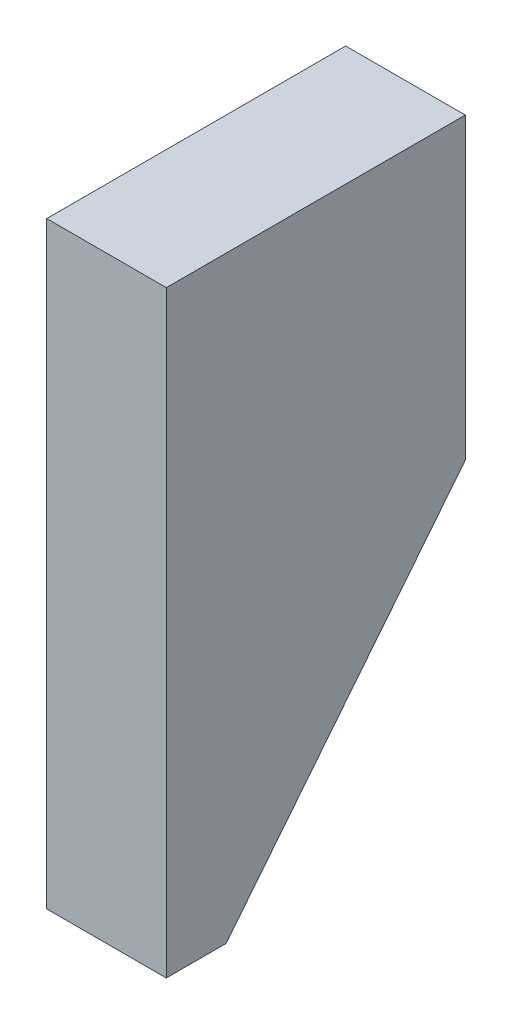
ISO-10303-21;
HEADER;
FILE_DESCRIPTION(('STEP AP214'),'2;1');
FILE_NAME('part.step','',(''),(''),'','','');
FILE_SCHEMA(('AUTOMOTIVE_DESIGN { 1 0 10303 214 1 1 1 1 }'));
ENDSEC;
DATA;
#1=APPLICATION_CONTEXT('core data for automotive mechanical design processes');
#2=APPLICATION_PROTOCOL_DEFINITION('international standard','automotive_design',2000,#1);
#3=PRODUCT_CONTEXT('',#1,'mechanical');
#4=PRODUCT('Part','Part','',(#3));
#5=PRODUCT_RELATED_PRODUCT_CATEGORY('part','',(#4));
#6=PRODUCT_DEFINITION_FORMATION('','',#4);
#7=PRODUCT_DEFINITION_CONTEXT('part definition',#1,'design');
#8=PRODUCT_DEFINITION('design','',#6,#7);
#9=PRODUCT_DEFINITION_SHAPE('','',#8);
#10=(LENGTH_UNIT() NAMED_UNIT(*) SI_UNIT(.MILLI.,.METRE.));
#11=(NAMED_UNIT(*) PLANE_ANGLE_UNIT() SI_UNIT($,.RADIAN.));
#12=(NAMED_UNIT(*) SI_UNIT($,.STERADIAN.) SOLID_ANGLE_UNIT());
#13=UNCERTAINTY_MEASURE_WITH_UNIT(LENGTH_MEASURE(1.E-05),#10,'distance_accuracy_value','');
#14=(GEOMETRIC_REPRESENTATION_CONTEXT(3) GLOBAL_UNCERTAINTY_ASSIGNED_CONTEXT((#13)) GLOBAL_UNIT_ASSIGNED_CONTEXT((#10,
#11,#12)) REPRESENTATION_CONTEXT('',''));
#15=CARTESIAN_POINT('',(0.,0.,0.));
#16=DIRECTION('',(0.,0.,1.));
#17=DIRECTION('',(1.,0.,0.));
#18=AXIS2_PLACEMENT_3D('',#15,#16,#17);
#19=CARTESIAN_POINT('',(0.,0.,0.));
#20=DIRECTION('',(-1.,0.,0.));
#21=DIRECTION('',(0.,0.,1.));
#22=AXIS2_PLACEMENT_3D('',#19,#20,#21);
#23=PLANE('',#22);
#24=DIRECTION('',(0.,1.,0.));
#25=VECTOR('',#24,1.);
#26=CARTESIAN_POINT('',(0.,-50.,25.));
#27=LINE('',#26,#25);
#28=CARTESIAN_POINT('',(0.,-50.,25.));
#29=VERTEX_POINT('',#28);
#30=CARTESIAN_POINT('',(0.,50.,25.));
#31=VERTEX_POINT('',#30);
#32=EDGE_CURVE('E61',#29,#31,#27,.T.);
#33=ORIENTED_EDGE('',*,*,#32,.T.);
#34=DIRECTION('',(0.,0.,-1.));
#35=VECTOR('',#34,1.);
#36=CARTESIAN_POINT('',(0.,50.,25.));
#37=LINE('',#36,#35);
#38=CARTESIAN_POINT('',(0.,50.,-25.));
#39=VERTEX_POINT('',#38);
#40=EDGE_CURVE('E82',#31,#39,#37,.T.);
#41=ORIENTED_EDGE('',*,*,#40,.T.);
#42=DIRECTION('',(0.,1.,0.));
#43=VECTOR('',#42,1.);
#44=CARTESIAN_POINT('',(0.,-50.,-25.));
#45=LINE('',#44,#43);
#46=CARTESIAN_POINT('',(0.,0.,-25.));
#47=VERTEX_POINT('',#46);
#48=EDGE_CURVE('E87',#39,#47,#45,.F.);
#49=ORIENTED_EDGE('',*,*,#48,.T.);
#50=DIRECTION('',(0.,0.78086880944303,-0.624695047554424));
#51=VECTOR('',#50,1.);
#52=CARTESIAN_POINT('',(0.,-50.,15.));
#53=LINE('',#52,#51);
#54=CARTESIAN_POINT('',(0.,-50.,15.));
#55=VERTEX_POINT('',#54);
#56=EDGE_CURVE('E64',#55,#47,#53,.T.);
#57=ORIENTED_EDGE('',*,*,#56,.F.);
#58=DIRECTION('',(0.,0.,1.));
#59=VECTOR('',#58,1.);
#60=CARTESIAN_POINT('',(0.,-50.,25.));
#61=LINE('',#60,#59);
#62=EDGE_CURVE('E20',#55,#29,#61,.T.);
#63=ORIENTED_EDGE('',*,*,#62,.T.);
#64=EDGE_LOOP('',(#33,#41,#49,#57,#63));
#65=FACE_BOUND('',#64,.T.);
#66=ADVANCED_FACE('F17',(#65),#23,.T.);
#67=CARTESIAN_POINT('',(20.,-50.,25.));
#68=DIRECTION('',(0.,1.,0.));
#69=DIRECTION('',(0.,0.,1.));
#70=AXIS2_PLACEMENT_3D('',#67,#68,#69);
#71=PLANE('',#70);
#72=DIRECTION('',(0.,0.,1.));
#73=VECTOR('',#72,1.);
#74=CARTESIAN_POINT('',(20.,-50.,0.));
#75=LINE('',#74,#73);
#76=CARTESIAN_POINT('',(20.,-50.,15.));
#77=VERTEX_POINT('',#76);
#78=CARTESIAN_POINT('',(20.,-50.,25.));
#79=VERTEX_POINT('',#78);
#80=EDGE_CURVE('E79',#77,#79,#75,.T.);
#81=ORIENTED_EDGE('',*,*,#80,.T.);
#82=DIRECTION('',(-1.,0.,0.));
#83=VECTOR('',#82,1.);
#84=CARTESIAN_POINT('',(20.,-50.,25.));
#85=LINE('',#84,#83);
#86=EDGE_CURVE('E69',#79,#29,#85,.T.);
#87=ORIENTED_EDGE('',*,*,#86,.T.);
#88=ORIENTED_EDGE('',*,*,#62,.F.);
#89=DIRECTION('',(1.,0.,0.));
#90=VECTOR('',#89,1.);
#91=CARTESIAN_POINT('',(-146.972708645007,-50.,15.));
#92=LINE('',#91,#90);
#93=EDGE_CURVE('E90',#77,#55,#92,.F.);
#94=ORIENTED_EDGE('',*,*,#93,.F.);
#95=EDGE_LOOP('',(#81,#87,#88,#94));
#96=FACE_BOUND('',#95,.T.);
#97=ADVANCED_FACE('F78',(#96),#71,.F.);
#98=CARTESIAN_POINT('',(20.,-50.,25.));
#99=DIRECTION('',(0.,0.,-1.));
#100=DIRECTION('',(-1.,0.,0.));
#101=AXIS2_PLACEMENT_3D('',#98,#99,#100);
#102=PLANE('',#101);
#103=ORIENTED_EDGE('',*,*,#86,.F.);
#104=DIRECTION('',(0.,1.,0.));
#105=VECTOR('',#104,1.);
#106=CARTESIAN_POINT('',(20.,0.,25.));
#107=LINE('',#106,#105);
#108=CARTESIAN_POINT('',(20.,50.,25.));
#109=VERTEX_POINT('',#108);
#110=EDGE_CURVE('E94',#79,#109,#107,.T.);
#111=ORIENTED_EDGE('',*,*,#110,.T.);
#112=DIRECTION('',(1.,0.,0.));
#113=VECTOR('',#112,1.);
#114=CARTESIAN_POINT('',(20.,50.,25.));
#115=LINE('',#114,#113);
#116=EDGE_CURVE('E75',#109,#31,#115,.F.);
#117=ORIENTED_EDGE('',*,*,#116,.T.);
#118=ORIENTED_EDGE('',*,*,#32,.F.);
#119=EDGE_LOOP('',(#103,#111,#117,#118));
#120=FACE_BOUND('',#119,.T.);
#121=ADVANCED_FACE('F72',(#120),#102,.F.);
#122=CARTESIAN_POINT('',(20.,50.,25.));
#123=DIRECTION('',(0.,-1.,0.));
#124=DIRECTION('',(0.,0.,-1.));
#125=AXIS2_PLACEMENT_3D('',#122,#123,#124);
#126=PLANE('',#125);
#127=ORIENTED_EDGE('',*,*,#116,.F.);
#128=DIRECTION('',(0.,0.,1.));
#129=VECTOR('',#128,1.);
#130=CARTESIAN_POINT('',(20.,50.,0.));
#131=LINE('',#130,#129);
#132=CARTESIAN_POINT('',(20.,50.,-25.));
#133=VERTEX_POINT('',#132);
#134=EDGE_CURVE('E96',#109,#133,#131,.F.);
#135=ORIENTED_EDGE('',*,*,#134,.T.);
#136=DIRECTION('',(1.,0.,0.));
#137=VECTOR('',#136,1.);
#138=CARTESIAN_POINT('',(20.,50.,-25.));
#139=LINE('',#138,#137);
#140=EDGE_CURVE('E84',#133,#39,#139,.F.);
#141=ORIENTED_EDGE('',*,*,#140,.T.);
#142=ORIENTED_EDGE('',*,*,#40,.F.);
#143=EDGE_LOOP('',(#127,#135,#141,#142));
#144=FACE_BOUND('',#143,.T.);
#145=ADVANCED_FACE('F108',(#144),#126,.F.);
#146=CARTESIAN_POINT('',(20.,-50.,-25.));
#147=DIRECTION('',(0.,0.,1.));
#148=DIRECTION('',(1.,0.,0.));
#149=AXIS2_PLACEMENT_3D('',#146,#147,#148);
#150=PLANE('',#149);
#151=ORIENTED_EDGE('',*,*,#48,.F.);
#152=ORIENTED_EDGE('',*,*,#140,.F.);
#153=DIRECTION('',(0.,1.,0.));
#154=VECTOR('',#153,1.);
#155=CARTESIAN_POINT('',(20.,0.,-25.));
#156=LINE('',#155,#154);
#157=CARTESIAN_POINT('',(20.,0.,-25.));
#158=VERTEX_POINT('',#157);
#159=EDGE_CURVE('E26',#133,#158,#156,.F.);
#160=ORIENTED_EDGE('',*,*,#159,.T.);
#161=DIRECTION('',(1.,0.,0.));
#162=VECTOR('',#161,1.);
#163=CARTESIAN_POINT('',(-146.972708645007,0.,-25.));
#164=LINE('',#163,#162);
#165=EDGE_CURVE('E34',#47,#158,#164,.T.);
#166=ORIENTED_EDGE('',*,*,#165,.F.);
#167=EDGE_LOOP('',(#151,#152,#160,#166));
#168=FACE_BOUND('',#167,.T.);
#169=ADVANCED_FACE('F103',(#168),#150,.F.);
#170=CARTESIAN_POINT('',(-146.972708645007,-50.,15.));
#171=DIRECTION('',(0.,-0.624695047554424,-0.78086880944303));
#172=DIRECTION('',(0.,0.78086880944303,-0.624695047554424));
#173=AXIS2_PLACEMENT_3D('',#170,#171,#172);
#174=PLANE('',#173);
#175=ORIENTED_EDGE('',*,*,#93,.T.);
#176=ORIENTED_EDGE('',*,*,#56,.T.);
#177=ORIENTED_EDGE('',*,*,#165,.T.);
#178=DIRECTION('',(0.,-0.78086880944303,0.624695047554424));
#179=VECTOR('',#178,1.);
#180=CARTESIAN_POINT('',(20.,0.,-25.));
#181=LINE('',#180,#179);
#182=EDGE_CURVE('E11',#158,#77,#181,.T.);
#183=ORIENTED_EDGE('',*,*,#182,.T.);
#184=EDGE_LOOP('',(#175,#176,#177,#183));
#185=FACE_BOUND('',#184,.T.);
#186=ADVANCED_FACE('F109',(#185),#174,.T.);
#187=CARTESIAN_POINT('',(20.,0.,0.));
#188=DIRECTION('',(-1.,0.,0.));
#189=DIRECTION('',(0.,0.,1.));
#190=AXIS2_PLACEMENT_3D('',#187,#188,#189);
#191=PLANE('',#190);
#192=ORIENTED_EDGE('',*,*,#159,.F.);
#193=ORIENTED_EDGE('',*,*,#134,.F.);
#194=ORIENTED_EDGE('',*,*,#110,.F.);
#195=ORIENTED_EDGE('',*,*,#80,.F.);
#196=ORIENTED_EDGE('',*,*,#182,.F.);
#197=EDGE_LOOP('',(#192,#193,#194,#195,#196));
#198=FACE_BOUND('',#197,.T.);
#199=ADVANCED_FACE('F106',(#198),#191,.F.);
#200=CLOSED_SHELL('',(#66,#97,#121,#145,#169,#186,#199));
#201=MANIFOLD_SOLID_BREP('B1',#200);
#202=ADVANCED_BREP_SHAPE_REPRESENTATION('',(#18,#201),#14);
#203=SHAPE_DEFINITION_REPRESENTATION(#9,#202);
ENDSEC;
END-ISO-10303-21;
